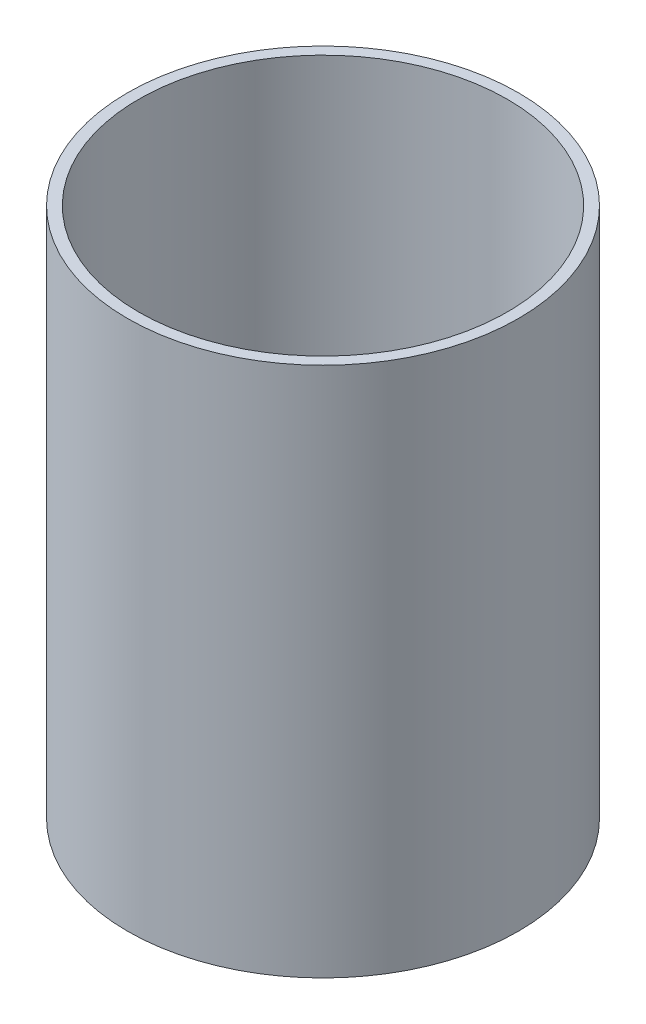
ISO-10303-21;
HEADER;
FILE_DESCRIPTION(('STEP AP214'),'2;1');
FILE_NAME('part.step','',(''),(''),'','','');
FILE_SCHEMA(('AUTOMOTIVE_DESIGN { 1 0 10303 214 1 1 1 1 }'));
ENDSEC;
DATA;
#1=APPLICATION_CONTEXT('core data for automotive mechanical design processes');
#2=APPLICATION_PROTOCOL_DEFINITION('international standard','automotive_design',2000,#1);
#3=PRODUCT_CONTEXT('',#1,'mechanical');
#4=PRODUCT('Part','Part','',(#3));
#5=PRODUCT_RELATED_PRODUCT_CATEGORY('part','',(#4));
#6=PRODUCT_DEFINITION_FORMATION('','',#4);
#7=PRODUCT_DEFINITION_CONTEXT('part definition',#1,'design');
#8=PRODUCT_DEFINITION('design','',#6,#7);
#9=PRODUCT_DEFINITION_SHAPE('','',#8);
#10=(LENGTH_UNIT() NAMED_UNIT(*) SI_UNIT(.MILLI.,.METRE.));
#11=(NAMED_UNIT(*) PLANE_ANGLE_UNIT() SI_UNIT($,.RADIAN.));
#12=(NAMED_UNIT(*) SI_UNIT($,.STERADIAN.) SOLID_ANGLE_UNIT());
#13=UNCERTAINTY_MEASURE_WITH_UNIT(LENGTH_MEASURE(1.E-05),#10,'distance_accuracy_value','');
#14=(GEOMETRIC_REPRESENTATION_CONTEXT(3) GLOBAL_UNCERTAINTY_ASSIGNED_CONTEXT((#13)) GLOBAL_UNIT_ASSIGNED_CONTEXT((#10,
#11,#12)) REPRESENTATION_CONTEXT('',''));
#15=CARTESIAN_POINT('',(0.,0.,0.));
#16=DIRECTION('',(0.,0.,1.));
#17=DIRECTION('',(1.,0.,0.));
#18=AXIS2_PLACEMENT_3D('',#15,#16,#17);
#19=CARTESIAN_POINT('',(0.,0.,0.));
#20=DIRECTION('',(0.,1.,0.));
#21=DIRECTION('',(0.,0.,1.));
#22=AXIS2_PLACEMENT_3D('',#19,#20,#21);
#23=PLANE('',#22);
#24=CARTESIAN_POINT('',(0.,0.,0.));
#25=DIRECTION('',(0.,1.,0.));
#26=DIRECTION('',(0.,0.,1.));
#27=AXIS2_PLACEMENT_3D('',#24,#25,#26);
#28=CIRCLE('',#27,35.);
#29=CARTESIAN_POINT('',(0.,0.,35.));
#30=VERTEX_POINT('',#29);
#31=EDGE_CURVE('E10',#30,#30,#28,.T.);
#32=ORIENTED_EDGE('',*,*,#31,.F.);
#33=EDGE_LOOP('',(#32));
#34=FACE_BOUND('',#33,.T.);
#35=ADVANCED_FACE('F37',(#34),#23,.F.);
#36=CARTESIAN_POINT('',(0.,25.6164936721639,0.));
#37=DIRECTION('',(0.,1.,0.));
#38=DIRECTION('',(0.,0.,1.));
#39=AXIS2_PLACEMENT_3D('',#36,#37,#38);
#40=CYLINDRICAL_SURFACE('',#39,35.);
#41=CARTESIAN_POINT('',(0.,95.,0.));
#42=DIRECTION('',(0.,1.,0.));
#43=DIRECTION('',(0.,0.,1.));
#44=AXIS2_PLACEMENT_3D('',#41,#42,#43);
#45=CIRCLE('',#44,35.);
#46=CARTESIAN_POINT('',(0.,95.,35.));
#47=VERTEX_POINT('',#46);
#48=EDGE_CURVE('E44',#47,#47,#45,.T.);
#49=ORIENTED_EDGE('',*,*,#48,.F.);
#50=EDGE_LOOP('',(#49));
#51=FACE_BOUND('',#50,.T.);
#52=ORIENTED_EDGE('',*,*,#31,.T.);
#53=EDGE_LOOP('',(#52));
#54=FACE_BOUND('',#53,.T.);
#55=ADVANCED_FACE('F71',(#51,#54),#40,.T.);
#56=CARTESIAN_POINT('',(35.,95.,0.));
#57=DIRECTION('',(0.,-1.,0.));
#58=DIRECTION('',(0.,0.,-1.));
#59=AXIS2_PLACEMENT_3D('',#56,#57,#58);
#60=PLANE('',#59);
#61=CARTESIAN_POINT('',(0.,95.,0.));
#62=DIRECTION('',(0.,1.,0.));
#63=DIRECTION('',(0.,0.,1.));
#64=AXIS2_PLACEMENT_3D('',#61,#62,#63);
#65=CIRCLE('',#64,33.);
#66=CARTESIAN_POINT('',(0.,95.,33.));
#67=VERTEX_POINT('',#66);
#68=EDGE_CURVE('E49',#67,#67,#65,.T.);
#69=ORIENTED_EDGE('',*,*,#68,.F.);
#70=EDGE_LOOP('',(#69));
#71=FACE_BOUND('',#70,.T.);
#72=ORIENTED_EDGE('',*,*,#48,.T.);
#73=EDGE_LOOP('',(#72));
#74=FACE_BOUND('',#73,.T.);
#75=ADVANCED_FACE('F66',(#71,#74),#60,.F.);
#76=CARTESIAN_POINT('',(0.,25.6164936721639,0.));
#77=DIRECTION('',(0.,1.,0.));
#78=DIRECTION('',(0.,0.,1.));
#79=AXIS2_PLACEMENT_3D('',#76,#77,#78);
#80=CYLINDRICAL_SURFACE('',#79,33.);
#81=CARTESIAN_POINT('',(0.,2.,0.));
#82=DIRECTION('',(0.,1.,0.));
#83=DIRECTION('',(0.,0.,1.));
#84=AXIS2_PLACEMENT_3D('',#81,#82,#83);
#85=CIRCLE('',#84,33.);
#86=CARTESIAN_POINT('',(0.,2.,33.));
#87=VERTEX_POINT('',#86);
#88=EDGE_CURVE('E54',#87,#87,#85,.T.);
#89=ORIENTED_EDGE('',*,*,#88,.F.);
#90=EDGE_LOOP('',(#89));
#91=FACE_BOUND('',#90,.T.);
#92=ORIENTED_EDGE('',*,*,#68,.T.);
#93=EDGE_LOOP('',(#92));
#94=FACE_BOUND('',#93,.T.);
#95=ADVANCED_FACE('F63',(#91,#94),#80,.F.);
#96=CARTESIAN_POINT('',(33.,2.,0.));
#97=DIRECTION('',(0.,-1.,0.));
#98=DIRECTION('',(0.,0.,-1.));
#99=AXIS2_PLACEMENT_3D('',#96,#97,#98);
#100=PLANE('',#99);
#101=ORIENTED_EDGE('',*,*,#88,.T.);
#102=EDGE_LOOP('',(#101));
#103=FACE_BOUND('',#102,.T.);
#104=ADVANCED_FACE('F61',(#103),#100,.F.);
#105=CLOSED_SHELL('',(#35,#55,#75,#95,#104));
#106=MANIFOLD_SOLID_BREP('B2',#105);
#107=ADVANCED_BREP_SHAPE_REPRESENTATION('',(#18,#106),#14);
#108=SHAPE_DEFINITION_REPRESENTATION(#9,#107);
ENDSEC;
END-ISO-10303-21;
